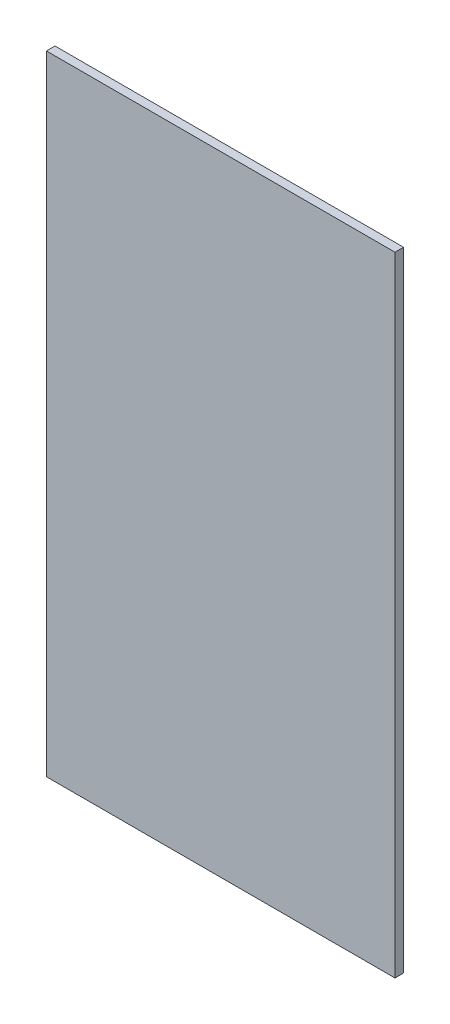
ISO-10303-21;
HEADER;
FILE_DESCRIPTION(('STEP AP214'),'2;1');
FILE_NAME('part.step','',(''),(''),'','','');
FILE_SCHEMA(('AUTOMOTIVE_DESIGN { 1 0 10303 214 1 1 1 1 }'));
ENDSEC;
DATA;
#1=APPLICATION_CONTEXT('core data for automotive mechanical design processes');
#2=APPLICATION_PROTOCOL_DEFINITION('international standard','automotive_design',2000,#1);
#3=PRODUCT_CONTEXT('',#1,'mechanical');
#4=PRODUCT('Part','Part','',(#3));
#5=PRODUCT_RELATED_PRODUCT_CATEGORY('part','',(#4));
#6=PRODUCT_DEFINITION_FORMATION('','',#4);
#7=PRODUCT_DEFINITION_CONTEXT('part definition',#1,'design');
#8=PRODUCT_DEFINITION('design','',#6,#7);
#9=PRODUCT_DEFINITION_SHAPE('','',#8);
#10=(LENGTH_UNIT() NAMED_UNIT(*) SI_UNIT(.MILLI.,.METRE.));
#11=(NAMED_UNIT(*) PLANE_ANGLE_UNIT() SI_UNIT($,.RADIAN.));
#12=(NAMED_UNIT(*) SI_UNIT($,.STERADIAN.) SOLID_ANGLE_UNIT());
#13=UNCERTAINTY_MEASURE_WITH_UNIT(LENGTH_MEASURE(1.E-05),#10,'distance_accuracy_value','');
#14=(GEOMETRIC_REPRESENTATION_CONTEXT(3) GLOBAL_UNCERTAINTY_ASSIGNED_CONTEXT((#13)) GLOBAL_UNIT_ASSIGNED_CONTEXT((#10,
#11,#12)) REPRESENTATION_CONTEXT('',''));
#15=CARTESIAN_POINT('',(0.,0.,0.));
#16=DIRECTION('',(0.,0.,1.));
#17=DIRECTION('',(1.,0.,0.));
#18=AXIS2_PLACEMENT_3D('',#15,#16,#17);
#19=CARTESIAN_POINT('',(61.,-110.,3.));
#20=DIRECTION('',(-1.,0.,0.));
#21=DIRECTION('',(0.,0.,1.));
#22=AXIS2_PLACEMENT_3D('',#19,#20,#21);
#23=PLANE('',#22);
#24=DIRECTION('',(0.,1.,0.));
#25=VECTOR('',#24,1.);
#26=CARTESIAN_POINT('',(61.,-110.,0.));
#27=LINE('',#26,#25);
#28=CARTESIAN_POINT('',(61.,-110.,0.));
#29=VERTEX_POINT('',#28);
#30=CARTESIAN_POINT('',(61.,110.,0.));
#31=VERTEX_POINT('',#30);
#32=EDGE_CURVE('E96',#29,#31,#27,.T.);
#33=ORIENTED_EDGE('',*,*,#32,.T.);
#34=DIRECTION('',(0.,0.,-1.));
#35=VECTOR('',#34,1.);
#36=CARTESIAN_POINT('',(61.,110.,3.));
#37=LINE('',#36,#35);
#38=CARTESIAN_POINT('',(61.,110.,3.));
#39=VERTEX_POINT('',#38);
#40=EDGE_CURVE('E11',#39,#31,#37,.T.);
#41=ORIENTED_EDGE('',*,*,#40,.F.);
#42=DIRECTION('',(0.,1.,0.));
#43=VECTOR('',#42,1.);
#44=CARTESIAN_POINT('',(61.,-110.,3.));
#45=LINE('',#44,#43);
#46=CARTESIAN_POINT('',(61.,-110.,3.));
#47=VERTEX_POINT('',#46);
#48=EDGE_CURVE('E84',#47,#39,#45,.T.);
#49=ORIENTED_EDGE('',*,*,#48,.F.);
#50=DIRECTION('',(0.,0.,-1.));
#51=VECTOR('',#50,1.);
#52=CARTESIAN_POINT('',(61.,-110.,3.));
#53=LINE('',#52,#51);
#54=EDGE_CURVE('E92',#47,#29,#53,.T.);
#55=ORIENTED_EDGE('',*,*,#54,.T.);
#56=EDGE_LOOP('',(#33,#41,#49,#55));
#57=FACE_BOUND('',#56,.T.);
#58=ADVANCED_FACE('F33',(#57),#23,.F.);
#59=CARTESIAN_POINT('',(-61.,110.,3.));
#60=DIRECTION('',(0.,-1.,0.));
#61=DIRECTION('',(0.,0.,-1.));
#62=AXIS2_PLACEMENT_3D('',#59,#60,#61);
#63=PLANE('',#62);
#64=DIRECTION('',(-1.,0.,0.));
#65=VECTOR('',#64,1.);
#66=CARTESIAN_POINT('',(-61.,110.,0.));
#67=LINE('',#66,#65);
#68=CARTESIAN_POINT('',(-61.,110.,0.));
#69=VERTEX_POINT('',#68);
#70=EDGE_CURVE('E88',#31,#69,#67,.T.);
#71=ORIENTED_EDGE('',*,*,#70,.T.);
#72=DIRECTION('',(0.,0.,-1.));
#73=VECTOR('',#72,1.);
#74=CARTESIAN_POINT('',(-61.,110.,3.));
#75=LINE('',#74,#73);
#76=CARTESIAN_POINT('',(-61.,110.,3.));
#77=VERTEX_POINT('',#76);
#78=EDGE_CURVE('E41',#77,#69,#75,.T.);
#79=ORIENTED_EDGE('',*,*,#78,.F.);
#80=DIRECTION('',(-1.,0.,0.));
#81=VECTOR('',#80,1.);
#82=CARTESIAN_POINT('',(-61.,110.,3.));
#83=LINE('',#82,#81);
#84=EDGE_CURVE('E79',#39,#77,#83,.T.);
#85=ORIENTED_EDGE('',*,*,#84,.F.);
#86=ORIENTED_EDGE('',*,*,#40,.T.);
#87=EDGE_LOOP('',(#71,#79,#85,#86));
#88=FACE_BOUND('',#87,.T.);
#89=ADVANCED_FACE('F87',(#88),#63,.F.);
#90=CARTESIAN_POINT('',(-61.,-110.,3.));
#91=DIRECTION('',(1.,0.,0.));
#92=DIRECTION('',(0.,0.,-1.));
#93=AXIS2_PLACEMENT_3D('',#90,#91,#92);
#94=PLANE('',#93);
#95=DIRECTION('',(0.,-1.,0.));
#96=VECTOR('',#95,1.);
#97=CARTESIAN_POINT('',(-61.,-110.,0.));
#98=LINE('',#97,#96);
#99=CARTESIAN_POINT('',(-61.,-110.,0.));
#100=VERTEX_POINT('',#99);
#101=EDGE_CURVE('E66',#69,#100,#98,.T.);
#102=ORIENTED_EDGE('',*,*,#101,.T.);
#103=DIRECTION('',(0.,0.,-1.));
#104=VECTOR('',#103,1.);
#105=CARTESIAN_POINT('',(-61.,-110.,3.));
#106=LINE('',#105,#104);
#107=CARTESIAN_POINT('',(-61.,-110.,3.));
#108=VERTEX_POINT('',#107);
#109=EDGE_CURVE('E89',#108,#100,#106,.T.);
#110=ORIENTED_EDGE('',*,*,#109,.F.);
#111=DIRECTION('',(0.,-1.,0.));
#112=VECTOR('',#111,1.);
#113=CARTESIAN_POINT('',(-61.,-110.,3.));
#114=LINE('',#113,#112);
#115=EDGE_CURVE('E82',#77,#108,#114,.T.);
#116=ORIENTED_EDGE('',*,*,#115,.F.);
#117=ORIENTED_EDGE('',*,*,#78,.T.);
#118=EDGE_LOOP('',(#102,#110,#116,#117));
#119=FACE_BOUND('',#118,.T.);
#120=ADVANCED_FACE('F90',(#119),#94,.F.);
#121=CARTESIAN_POINT('',(-61.,-110.,3.));
#122=DIRECTION('',(0.,1.,0.));
#123=DIRECTION('',(0.,0.,1.));
#124=AXIS2_PLACEMENT_3D('',#121,#122,#123);
#125=PLANE('',#124);
#126=DIRECTION('',(1.,0.,0.));
#127=VECTOR('',#126,1.);
#128=CARTESIAN_POINT('',(-61.,-110.,0.));
#129=LINE('',#128,#127);
#130=EDGE_CURVE('E72',#100,#29,#129,.T.);
#131=ORIENTED_EDGE('',*,*,#130,.T.);
#132=ORIENTED_EDGE('',*,*,#54,.F.);
#133=DIRECTION('',(1.,0.,0.));
#134=VECTOR('',#133,1.);
#135=CARTESIAN_POINT('',(-61.,-110.,3.));
#136=LINE('',#135,#134);
#137=EDGE_CURVE('E49',#108,#47,#136,.T.);
#138=ORIENTED_EDGE('',*,*,#137,.F.);
#139=ORIENTED_EDGE('',*,*,#109,.T.);
#140=EDGE_LOOP('',(#131,#132,#138,#139));
#141=FACE_BOUND('',#140,.T.);
#142=ADVANCED_FACE('F103',(#141),#125,.F.);
#143=CARTESIAN_POINT('',(0.,0.,3.));
#144=DIRECTION('',(0.,0.,-1.));
#145=DIRECTION('',(-1.,0.,0.));
#146=AXIS2_PLACEMENT_3D('',#143,#144,#145);
#147=PLANE('',#146);
#148=ORIENTED_EDGE('',*,*,#48,.T.);
#149=ORIENTED_EDGE('',*,*,#84,.T.);
#150=ORIENTED_EDGE('',*,*,#115,.T.);
#151=ORIENTED_EDGE('',*,*,#137,.T.);
#152=EDGE_LOOP('',(#148,#149,#150,#151));
#153=FACE_BOUND('',#152,.T.);
#154=ADVANCED_FACE('F80',(#153),#147,.F.);
#155=CARTESIAN_POINT('',(0.,0.,0.));
#156=DIRECTION('',(0.,0.,-1.));
#157=DIRECTION('',(-1.,0.,0.));
#158=AXIS2_PLACEMENT_3D('',#155,#156,#157);
#159=PLANE('',#158);
#160=ORIENTED_EDGE('',*,*,#32,.F.);
#161=ORIENTED_EDGE('',*,*,#130,.F.);
#162=ORIENTED_EDGE('',*,*,#101,.F.);
#163=ORIENTED_EDGE('',*,*,#70,.F.);
#164=EDGE_LOOP('',(#160,#161,#162,#163));
#165=FACE_BOUND('',#164,.T.);
#166=ADVANCED_FACE('F106',(#165),#159,.T.);
#167=CLOSED_SHELL('',(#58,#89,#120,#142,#154,#166));
#168=MANIFOLD_SOLID_BREP('B2',#167);
#169=ADVANCED_BREP_SHAPE_REPRESENTATION('',(#18,#168),#14);
#170=SHAPE_DEFINITION_REPRESENTATION(#9,#169);
ENDSEC;
END-ISO-10303-21;
